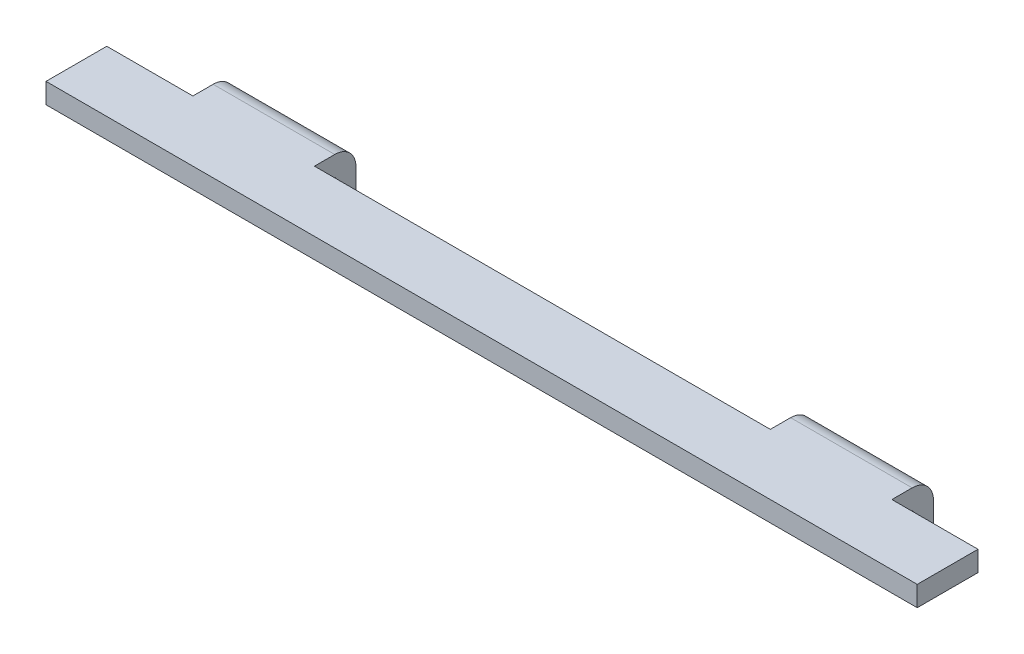
ISO-10303-21;
HEADER;
FILE_DESCRIPTION(('STEP AP214'),'2;1');
FILE_NAME('part.step','',(''),(''),'','','');
FILE_SCHEMA(('AUTOMOTIVE_DESIGN { 1 0 10303 214 1 1 1 1 }'));
ENDSEC;
DATA;
#1=APPLICATION_CONTEXT('core data for automotive mechanical design processes');
#2=APPLICATION_PROTOCOL_DEFINITION('international standard','automotive_design',2000,#1);
#3=PRODUCT_CONTEXT('',#1,'mechanical');
#4=PRODUCT('Part','Part','',(#3));
#5=PRODUCT_RELATED_PRODUCT_CATEGORY('part','',(#4));
#6=PRODUCT_DEFINITION_FORMATION('','',#4);
#7=PRODUCT_DEFINITION_CONTEXT('part definition',#1,'design');
#8=PRODUCT_DEFINITION('design','',#6,#7);
#9=PRODUCT_DEFINITION_SHAPE('','',#8);
#10=(LENGTH_UNIT() NAMED_UNIT(*) SI_UNIT(.MILLI.,.METRE.));
#11=(NAMED_UNIT(*) PLANE_ANGLE_UNIT() SI_UNIT($,.RADIAN.));
#12=(NAMED_UNIT(*) SI_UNIT($,.STERADIAN.) SOLID_ANGLE_UNIT());
#13=UNCERTAINTY_MEASURE_WITH_UNIT(LENGTH_MEASURE(1.E-05),#10,'distance_accuracy_value','');
#14=(GEOMETRIC_REPRESENTATION_CONTEXT(3) GLOBAL_UNCERTAINTY_ASSIGNED_CONTEXT((#13)) GLOBAL_UNIT_ASSIGNED_CONTEXT((#10,
#11,#12)) REPRESENTATION_CONTEXT('',''));
#15=CARTESIAN_POINT('',(0.,0.,0.));
#16=DIRECTION('',(0.,0.,1.));
#17=DIRECTION('',(1.,0.,0.));
#18=AXIS2_PLACEMENT_3D('',#15,#16,#17);
#19=CARTESIAN_POINT('',(0.,0.,-0.71));
#20=DIRECTION('',(0.,0.,-1.));
#21=DIRECTION('',(-1.,0.,0.));
#22=AXIS2_PLACEMENT_3D('',#19,#20,#21);
#23=PLANE('',#22);
#24=DIRECTION('',(0.,1.,0.));
#25=VECTOR('',#24,1.);
#26=CARTESIAN_POINT('',(3.45,0.,-0.71));
#27=LINE('',#26,#25);
#28=CARTESIAN_POINT('',(3.45,-0.53,-0.71));
#29=VERTEX_POINT('',#28);
#30=CARTESIAN_POINT('',(3.45,-0.00999999999999999,-0.71));
#31=VERTEX_POINT('',#30);
#32=EDGE_CURVE('E299',#29,#31,#27,.T.);
#33=ORIENTED_EDGE('',*,*,#32,.F.);
#34=DIRECTION('',(1.,0.,0.));
#35=VECTOR('',#34,1.);
#36=CARTESIAN_POINT('',(3.45,-0.53,-0.71));
#37=LINE('',#36,#35);
#38=CARTESIAN_POINT('',(2.25,-0.53,-0.71));
#39=VERTEX_POINT('',#38);
#40=EDGE_CURVE('E281',#29,#39,#37,.F.);
#41=ORIENTED_EDGE('',*,*,#40,.T.);
#42=DIRECTION('',(0.,1.,0.));
#43=VECTOR('',#42,1.);
#44=CARTESIAN_POINT('',(2.25,0.2,-0.71));
#45=LINE('',#44,#43);
#46=CARTESIAN_POINT('',(2.25,-0.00999999999999999,-0.71));
#47=VERTEX_POINT('',#46);
#48=EDGE_CURVE('E288',#47,#39,#45,.F.);
#49=ORIENTED_EDGE('',*,*,#48,.F.);
#50=DIRECTION('',(-1.,0.,0.));
#51=VECTOR('',#50,1.);
#52=CARTESIAN_POINT('',(2.25,-0.00999999999999998,-0.71));
#53=LINE('',#52,#51);
#54=EDGE_CURVE('E294',#31,#47,#53,.T.);
#55=ORIENTED_EDGE('',*,*,#54,.F.);
#56=EDGE_LOOP('',(#33,#41,#49,#55));
#57=FACE_BOUND('',#56,.T.);
#58=ADVANCED_FACE('F17',(#57),#23,.T.);
#59=CARTESIAN_POINT('',(3.45,-0.53,-0.71));
#60=DIRECTION('',(0.,1.,0.));
#61=DIRECTION('',(0.,0.,1.));
#62=AXIS2_PLACEMENT_3D('',#59,#60,#61);
#63=PLANE('',#62);
#64=DIRECTION('',(0.,0.,1.));
#65=VECTOR('',#64,1.);
#66=CARTESIAN_POINT('',(2.25,-0.53,-0.5));
#67=LINE('',#66,#65);
#68=CARTESIAN_POINT('',(2.25,-0.53,-0.51));
#69=VERTEX_POINT('',#68);
#70=EDGE_CURVE('E284',#39,#69,#67,.T.);
#71=ORIENTED_EDGE('',*,*,#70,.F.);
#72=ORIENTED_EDGE('',*,*,#40,.F.);
#73=DIRECTION('',(0.,0.,-1.));
#74=VECTOR('',#73,1.);
#75=CARTESIAN_POINT('',(3.45,-0.53,-0.5));
#76=LINE('',#75,#74);
#77=CARTESIAN_POINT('',(3.45,-0.53,-0.51));
#78=VERTEX_POINT('',#77);
#79=EDGE_CURVE('E174',#78,#29,#76,.T.);
#80=ORIENTED_EDGE('',*,*,#79,.F.);
#81=DIRECTION('',(-1.,0.,0.));
#82=VECTOR('',#81,1.);
#83=CARTESIAN_POINT('',(0.,-0.53,-0.51));
#84=LINE('',#83,#82);
#85=EDGE_CURVE('E166',#78,#69,#84,.T.);
#86=ORIENTED_EDGE('',*,*,#85,.T.);
#87=EDGE_LOOP('',(#71,#72,#80,#86));
#88=FACE_BOUND('',#87,.T.);
#89=ADVANCED_FACE('F450',(#88),#63,.F.);
#90=CARTESIAN_POINT('',(0.,0.,-0.51));
#91=DIRECTION('',(0.,0.,-1.));
#92=DIRECTION('',(-1.,0.,0.));
#93=AXIS2_PLACEMENT_3D('',#90,#91,#92);
#94=PLANE('',#93);
#95=DIRECTION('',(0.,1.,0.));
#96=VECTOR('',#95,1.);
#97=CARTESIAN_POINT('',(2.25,0.2,-0.51));
#98=LINE('',#97,#96);
#99=CARTESIAN_POINT('',(2.25,-0.01,-0.51));
#100=VERTEX_POINT('',#99);
#101=EDGE_CURVE('E287',#69,#100,#98,.T.);
#102=ORIENTED_EDGE('',*,*,#101,.F.);
#103=ORIENTED_EDGE('',*,*,#85,.F.);
#104=DIRECTION('',(0.,1.,0.));
#105=VECTOR('',#104,1.);
#106=CARTESIAN_POINT('',(3.45,0.,-0.51));
#107=LINE('',#106,#105);
#108=CARTESIAN_POINT('',(3.45,-0.01,-0.51));
#109=VERTEX_POINT('',#108);
#110=EDGE_CURVE('E169',#109,#78,#107,.F.);
#111=ORIENTED_EDGE('',*,*,#110,.F.);
#112=DIRECTION('',(-1.,0.,0.));
#113=VECTOR('',#112,1.);
#114=CARTESIAN_POINT('',(2.25,-0.01,-0.51));
#115=LINE('',#114,#113);
#116=EDGE_CURVE('E156',#109,#100,#115,.T.);
#117=ORIENTED_EDGE('',*,*,#116,.T.);
#118=EDGE_LOOP('',(#102,#103,#111,#117));
#119=FACE_BOUND('',#118,.T.);
#120=ADVANCED_FACE('F170',(#119),#94,.F.);
#121=CARTESIAN_POINT('',(2.25,-0.01,-0.5));
#122=DIRECTION('',(-1.,0.,0.));
#123=DIRECTION('',(0.,0.,1.));
#124=AXIS2_PLACEMENT_3D('',#121,#122,#123);
#125=CYLINDRICAL_SURFACE('',#124,0.01);
#126=DIRECTION('',(1.,0.,0.));
#127=VECTOR('',#126,1.);
#128=CARTESIAN_POINT('',(0.,0.,-0.5));
#129=LINE('',#128,#127);
#130=CARTESIAN_POINT('',(3.45,0.,-0.5));
#131=VERTEX_POINT('',#130);
#132=CARTESIAN_POINT('',(2.25,0.,-0.5));
#133=VERTEX_POINT('',#132);
#134=EDGE_CURVE('E151',#131,#133,#129,.F.);
#135=ORIENTED_EDGE('',*,*,#134,.T.);
#136=CARTESIAN_POINT('',(2.25,-0.01,-0.5));
#137=DIRECTION('',(-1.,0.,0.));
#138=DIRECTION('',(0.,0.,1.));
#139=AXIS2_PLACEMENT_3D('',#136,#137,#138);
#140=CIRCLE('',#139,0.01);
#141=EDGE_CURVE('E162',#100,#133,#140,.F.);
#142=ORIENTED_EDGE('',*,*,#141,.F.);
#143=ORIENTED_EDGE('',*,*,#116,.F.);
#144=CARTESIAN_POINT('',(3.45,-0.01,-0.5));
#145=DIRECTION('',(-1.,0.,0.));
#146=DIRECTION('',(0.,0.,1.));
#147=AXIS2_PLACEMENT_3D('',#144,#145,#146);
#148=CIRCLE('',#147,0.01);
#149=EDGE_CURVE('E20',#131,#109,#148,.T.);
#150=ORIENTED_EDGE('',*,*,#149,.F.);
#151=EDGE_LOOP('',(#135,#142,#143,#150));
#152=FACE_BOUND('',#151,.T.);
#153=ADVANCED_FACE('F158',(#152),#125,.F.);
#154=CARTESIAN_POINT('',(0.,0.,0.));
#155=DIRECTION('',(0.,1.,0.));
#156=DIRECTION('',(0.,0.,1.));
#157=AXIS2_PLACEMENT_3D('',#154,#155,#156);
#158=PLANE('',#157);
#159=DIRECTION('',(1.,0.,0.));
#160=VECTOR('',#159,1.);
#161=CARTESIAN_POINT('',(0.,0.,-0.3));
#162=LINE('',#161,#160);
#163=CARTESIAN_POINT('',(-3.45,0.,-0.3));
#164=VERTEX_POINT('',#163);
#165=CARTESIAN_POINT('',(-4.3,0.,-0.3));
#166=VERTEX_POINT('',#165);
#167=EDGE_CURVE('E254',#164,#166,#162,.F.);
#168=ORIENTED_EDGE('',*,*,#167,.F.);
#169=DIRECTION('',(0.,0.,1.));
#170=VECTOR('',#169,1.);
#171=CARTESIAN_POINT('',(-3.45,0.,0.));
#172=LINE('',#171,#170);
#173=CARTESIAN_POINT('',(-3.45,0.,-0.5));
#174=VERTEX_POINT('',#173);
#175=EDGE_CURVE('E276',#174,#164,#172,.T.);
#176=ORIENTED_EDGE('',*,*,#175,.F.);
#177=DIRECTION('',(-1.,0.,0.));
#178=VECTOR('',#177,1.);
#179=CARTESIAN_POINT('',(-3.45,0.,-0.5));
#180=LINE('',#179,#178);
#181=CARTESIAN_POINT('',(-2.25,0.,-0.5));
#182=VERTEX_POINT('',#181);
#183=EDGE_CURVE('E234',#174,#182,#180,.F.);
#184=ORIENTED_EDGE('',*,*,#183,.T.);
#185=DIRECTION('',(0.,0.,1.));
#186=VECTOR('',#185,1.);
#187=CARTESIAN_POINT('',(-2.25,0.,0.));
#188=LINE('',#187,#186);
#189=CARTESIAN_POINT('',(-2.25,0.,-0.3));
#190=VERTEX_POINT('',#189);
#191=EDGE_CURVE('E274',#190,#182,#188,.F.);
#192=ORIENTED_EDGE('',*,*,#191,.F.);
#193=DIRECTION('',(1.,0.,0.));
#194=VECTOR('',#193,1.);
#195=CARTESIAN_POINT('',(4.3,0.,-0.3));
#196=LINE('',#195,#194);
#197=CARTESIAN_POINT('',(2.25,0.,-0.3));
#198=VERTEX_POINT('',#197);
#199=EDGE_CURVE('E268',#190,#198,#196,.T.);
#200=ORIENTED_EDGE('',*,*,#199,.T.);
#201=DIRECTION('',(0.,0.,1.));
#202=VECTOR('',#201,1.);
#203=CARTESIAN_POINT('',(2.25,0.,-0.5));
#204=LINE('',#203,#202);
#205=EDGE_CURVE('E271',#133,#198,#204,.T.);
#206=ORIENTED_EDGE('',*,*,#205,.F.);
#207=ORIENTED_EDGE('',*,*,#134,.F.);
#208=DIRECTION('',(0.,0.,-1.));
#209=VECTOR('',#208,1.);
#210=CARTESIAN_POINT('',(3.45,0.,-0.5));
#211=LINE('',#210,#209);
#212=CARTESIAN_POINT('',(3.45,0.,-0.3));
#213=VERTEX_POINT('',#212);
#214=EDGE_CURVE('E178',#213,#131,#211,.T.);
#215=ORIENTED_EDGE('',*,*,#214,.F.);
#216=DIRECTION('',(1.,0.,0.));
#217=VECTOR('',#216,1.);
#218=CARTESIAN_POINT('',(4.3,0.,-0.3));
#219=LINE('',#218,#217);
#220=CARTESIAN_POINT('',(4.3,0.,-0.3));
#221=VERTEX_POINT('',#220);
#222=EDGE_CURVE('E181',#213,#221,#219,.T.);
#223=ORIENTED_EDGE('',*,*,#222,.T.);
#224=DIRECTION('',(0.,0.,1.));
#225=VECTOR('',#224,1.);
#226=CARTESIAN_POINT('',(4.3,0.,0.3));
#227=LINE('',#226,#225);
#228=CARTESIAN_POINT('',(4.3,0.,0.300000000000001));
#229=VERTEX_POINT('',#228);
#230=EDGE_CURVE('E199',#221,#229,#227,.T.);
#231=ORIENTED_EDGE('',*,*,#230,.T.);
#232=DIRECTION('',(-1.,0.,0.));
#233=VECTOR('',#232,1.);
#234=CARTESIAN_POINT('',(-4.3,0.,0.3));
#235=LINE('',#234,#233);
#236=CARTESIAN_POINT('',(-4.3,0.,0.3));
#237=VERTEX_POINT('',#236);
#238=EDGE_CURVE('E209',#229,#237,#235,.T.);
#239=ORIENTED_EDGE('',*,*,#238,.T.);
#240=DIRECTION('',(0.,0.,-1.));
#241=VECTOR('',#240,1.);
#242=CARTESIAN_POINT('',(-4.3,0.,-0.3));
#243=LINE('',#242,#241);
#244=EDGE_CURVE('E219',#237,#166,#243,.T.);
#245=ORIENTED_EDGE('',*,*,#244,.T.);
#246=EDGE_LOOP('',(#168,#176,#184,#192,#200,#206,#207,#215,#223,#231,#239,#245));
#247=FACE_BOUND('',#246,.T.);
#248=ADVANCED_FACE('F420',(#247),#158,.F.);
#249=CARTESIAN_POINT('',(0.,0.,-0.71));
#250=DIRECTION('',(0.,0.,-1.));
#251=DIRECTION('',(0.,1.,0.));
#252=AXIS2_PLACEMENT_3D('',#249,#250,#251);
#253=PLANE('',#252);
#254=DIRECTION('',(0.,1.,0.));
#255=VECTOR('',#254,1.);
#256=CARTESIAN_POINT('',(-2.25,0.,-0.71));
#257=LINE('',#256,#255);
#258=CARTESIAN_POINT('',(-2.25,-0.53,-0.71));
#259=VERTEX_POINT('',#258);
#260=CARTESIAN_POINT('',(-2.25,-0.00999999999999999,-0.71));
#261=VERTEX_POINT('',#260);
#262=EDGE_CURVE('E264',#259,#261,#257,.T.);
#263=ORIENTED_EDGE('',*,*,#262,.F.);
#264=DIRECTION('',(1.,0.,0.));
#265=VECTOR('',#264,1.);
#266=CARTESIAN_POINT('',(-2.25,-0.53,-0.71));
#267=LINE('',#266,#265);
#268=CARTESIAN_POINT('',(-3.45,-0.53,-0.71));
#269=VERTEX_POINT('',#268);
#270=EDGE_CURVE('E243',#259,#269,#267,.F.);
#271=ORIENTED_EDGE('',*,*,#270,.T.);
#272=DIRECTION('',(0.,1.,0.));
#273=VECTOR('',#272,1.);
#274=CARTESIAN_POINT('',(-3.45,0.2,-0.71));
#275=LINE('',#274,#273);
#276=CARTESIAN_POINT('',(-3.45,-0.00999999999999999,-0.71));
#277=VERTEX_POINT('',#276);
#278=EDGE_CURVE('E250',#277,#269,#275,.F.);
#279=ORIENTED_EDGE('',*,*,#278,.F.);
#280=DIRECTION('',(-1.,0.,0.));
#281=VECTOR('',#280,1.);
#282=CARTESIAN_POINT('',(-3.45,-0.00999999999999998,-0.71));
#283=LINE('',#282,#281);
#284=EDGE_CURVE('E257',#261,#277,#283,.T.);
#285=ORIENTED_EDGE('',*,*,#284,.F.);
#286=EDGE_LOOP('',(#263,#271,#279,#285));
#287=FACE_BOUND('',#286,.T.);
#288=ADVANCED_FACE('F434',(#287),#253,.T.);
#289=CARTESIAN_POINT('',(-2.25,-0.53,-0.71));
#290=DIRECTION('',(0.,1.,0.));
#291=DIRECTION('',(0.,0.,1.));
#292=AXIS2_PLACEMENT_3D('',#289,#290,#291);
#293=PLANE('',#292);
#294=DIRECTION('',(0.,0.,1.));
#295=VECTOR('',#294,1.);
#296=CARTESIAN_POINT('',(-3.45,-0.53,-0.5));
#297=LINE('',#296,#295);
#298=CARTESIAN_POINT('',(-3.45,-0.53,-0.51));
#299=VERTEX_POINT('',#298);
#300=EDGE_CURVE('E246',#269,#299,#297,.T.);
#301=ORIENTED_EDGE('',*,*,#300,.F.);
#302=ORIENTED_EDGE('',*,*,#270,.F.);
#303=DIRECTION('',(0.,0.,-1.));
#304=VECTOR('',#303,1.);
#305=CARTESIAN_POINT('',(-2.25,-0.53,-0.5));
#306=LINE('',#305,#304);
#307=CARTESIAN_POINT('',(-2.25,-0.53,-0.51));
#308=VERTEX_POINT('',#307);
#309=EDGE_CURVE('E261',#308,#259,#306,.T.);
#310=ORIENTED_EDGE('',*,*,#309,.F.);
#311=DIRECTION('',(1.,0.,0.));
#312=VECTOR('',#311,1.);
#313=CARTESIAN_POINT('',(0.,-0.53,-0.51));
#314=LINE('',#313,#312);
#315=EDGE_CURVE('E239',#308,#299,#314,.F.);
#316=ORIENTED_EDGE('',*,*,#315,.T.);
#317=EDGE_LOOP('',(#301,#302,#310,#316));
#318=FACE_BOUND('',#317,.T.);
#319=ADVANCED_FACE('F436',(#318),#293,.F.);
#320=CARTESIAN_POINT('',(0.,0.,-0.51));
#321=DIRECTION('',(0.,0.,-1.));
#322=DIRECTION('',(0.,1.,0.));
#323=AXIS2_PLACEMENT_3D('',#320,#321,#322);
#324=PLANE('',#323);
#325=DIRECTION('',(0.,1.,0.));
#326=VECTOR('',#325,1.);
#327=CARTESIAN_POINT('',(-3.45,0.2,-0.51));
#328=LINE('',#327,#326);
#329=CARTESIAN_POINT('',(-3.45,-0.01,-0.51));
#330=VERTEX_POINT('',#329);
#331=EDGE_CURVE('E249',#299,#330,#328,.T.);
#332=ORIENTED_EDGE('',*,*,#331,.F.);
#333=ORIENTED_EDGE('',*,*,#315,.F.);
#334=DIRECTION('',(0.,1.,0.));
#335=VECTOR('',#334,1.);
#336=CARTESIAN_POINT('',(-2.25,0.,-0.51));
#337=LINE('',#336,#335);
#338=CARTESIAN_POINT('',(-2.25,-0.01,-0.51));
#339=VERTEX_POINT('',#338);
#340=EDGE_CURVE('E265',#339,#308,#337,.F.);
#341=ORIENTED_EDGE('',*,*,#340,.F.);
#342=DIRECTION('',(-1.,0.,0.));
#343=VECTOR('',#342,1.);
#344=CARTESIAN_POINT('',(-3.45,-0.01,-0.51));
#345=LINE('',#344,#343);
#346=EDGE_CURVE('E237',#339,#330,#345,.T.);
#347=ORIENTED_EDGE('',*,*,#346,.T.);
#348=EDGE_LOOP('',(#332,#333,#341,#347));
#349=FACE_BOUND('',#348,.T.);
#350=ADVANCED_FACE('F412',(#349),#324,.F.);
#351=CARTESIAN_POINT('',(-3.45,-0.01,-0.5));
#352=DIRECTION('',(-1.,0.,0.));
#353=DIRECTION('',(0.,0.,1.));
#354=AXIS2_PLACEMENT_3D('',#351,#352,#353);
#355=CYLINDRICAL_SURFACE('',#354,0.01);
#356=ORIENTED_EDGE('',*,*,#183,.F.);
#357=CARTESIAN_POINT('',(-3.45,-0.01,-0.5));
#358=DIRECTION('',(-1.,0.,0.));
#359=DIRECTION('',(0.,0.,1.));
#360=AXIS2_PLACEMENT_3D('',#357,#358,#359);
#361=CIRCLE('',#360,0.01);
#362=EDGE_CURVE('E229',#330,#174,#361,.F.);
#363=ORIENTED_EDGE('',*,*,#362,.F.);
#364=ORIENTED_EDGE('',*,*,#346,.F.);
#365=CARTESIAN_POINT('',(-2.25,-0.01,-0.5));
#366=DIRECTION('',(-1.,0.,0.));
#367=DIRECTION('',(0.,0.,1.));
#368=AXIS2_PLACEMENT_3D('',#365,#366,#367);
#369=CIRCLE('',#368,0.01);
#370=EDGE_CURVE('E326',#182,#339,#369,.T.);
#371=ORIENTED_EDGE('',*,*,#370,.F.);
#372=EDGE_LOOP('',(#356,#363,#364,#371));
#373=FACE_BOUND('',#372,.T.);
#374=ADVANCED_FACE('F418',(#373),#355,.F.);
#375=CARTESIAN_POINT('',(-4.3,0.2,-0.3));
#376=DIRECTION('',(1.,0.,0.));
#377=DIRECTION('',(0.,0.,-1.));
#378=AXIS2_PLACEMENT_3D('',#375,#376,#377);
#379=PLANE('',#378);
#380=DIRECTION('',(0.,1.,0.));
#381=VECTOR('',#380,1.);
#382=CARTESIAN_POINT('',(-4.3,0.2,0.3));
#383=LINE('',#382,#381);
#384=CARTESIAN_POINT('',(-4.3,0.2,0.3));
#385=VERTEX_POINT('',#384);
#386=EDGE_CURVE('E217',#237,#385,#383,.T.);
#387=ORIENTED_EDGE('',*,*,#386,.T.);
#388=DIRECTION('',(0.,0.,1.));
#389=VECTOR('',#388,1.);
#390=CARTESIAN_POINT('',(-4.3,0.2,0.));
#391=LINE('',#390,#389);
#392=CARTESIAN_POINT('',(-4.3,0.2,-0.3));
#393=VERTEX_POINT('',#392);
#394=EDGE_CURVE('E214',#393,#385,#391,.T.);
#395=ORIENTED_EDGE('',*,*,#394,.F.);
#396=DIRECTION('',(0.,1.,0.));
#397=VECTOR('',#396,1.);
#398=CARTESIAN_POINT('',(-4.3,0.2,-0.3));
#399=LINE('',#398,#397);
#400=EDGE_CURVE('E226',#393,#166,#399,.F.);
#401=ORIENTED_EDGE('',*,*,#400,.T.);
#402=ORIENTED_EDGE('',*,*,#244,.F.);
#403=EDGE_LOOP('',(#387,#395,#401,#402));
#404=FACE_BOUND('',#403,.T.);
#405=ADVANCED_FACE('F467',(#404),#379,.F.);
#406=CARTESIAN_POINT('',(-4.3,0.2,0.3));
#407=DIRECTION('',(0.,0.,-1.));
#408=DIRECTION('',(-1.,0.,0.));
#409=AXIS2_PLACEMENT_3D('',#406,#407,#408);
#410=PLANE('',#409);
#411=DIRECTION('',(0.,1.,0.));
#412=VECTOR('',#411,1.);
#413=CARTESIAN_POINT('',(4.3,0.2,0.3));
#414=LINE('',#413,#412);
#415=CARTESIAN_POINT('',(4.3,0.2,0.3));
#416=VERTEX_POINT('',#415);
#417=EDGE_CURVE('E207',#229,#416,#414,.T.);
#418=ORIENTED_EDGE('',*,*,#417,.T.);
#419=DIRECTION('',(1.,0.,0.));
#420=VECTOR('',#419,1.);
#421=CARTESIAN_POINT('',(0.,0.2,0.3));
#422=LINE('',#421,#420);
#423=EDGE_CURVE('E204',#385,#416,#422,.T.);
#424=ORIENTED_EDGE('',*,*,#423,.F.);
#425=ORIENTED_EDGE('',*,*,#386,.F.);
#426=ORIENTED_EDGE('',*,*,#238,.F.);
#427=EDGE_LOOP('',(#418,#424,#425,#426));
#428=FACE_BOUND('',#427,.T.);
#429=ADVANCED_FACE('F465',(#428),#410,.F.);
#430=CARTESIAN_POINT('',(4.3,0.2,0.3));
#431=DIRECTION('',(-1.,0.,0.));
#432=DIRECTION('',(0.,0.,1.));
#433=AXIS2_PLACEMENT_3D('',#430,#431,#432);
#434=PLANE('',#433);
#435=DIRECTION('',(0.,1.,0.));
#436=VECTOR('',#435,1.);
#437=CARTESIAN_POINT('',(4.3,0.2,-0.3));
#438=LINE('',#437,#436);
#439=CARTESIAN_POINT('',(4.3,0.2,-0.3));
#440=VERTEX_POINT('',#439);
#441=EDGE_CURVE('E197',#221,#440,#438,.T.);
#442=ORIENTED_EDGE('',*,*,#441,.T.);
#443=DIRECTION('',(0.,0.,1.));
#444=VECTOR('',#443,1.);
#445=CARTESIAN_POINT('',(4.3,0.2,0.));
#446=LINE('',#445,#444);
#447=EDGE_CURVE('E194',#416,#440,#446,.F.);
#448=ORIENTED_EDGE('',*,*,#447,.F.);
#449=ORIENTED_EDGE('',*,*,#417,.F.);
#450=ORIENTED_EDGE('',*,*,#230,.F.);
#451=EDGE_LOOP('',(#442,#448,#449,#450));
#452=FACE_BOUND('',#451,.T.);
#453=ADVANCED_FACE('F462',(#452),#434,.F.);
#454=CARTESIAN_POINT('',(4.3,0.2,-0.3));
#455=DIRECTION('',(0.,0.,1.));
#456=DIRECTION('',(1.,0.,0.));
#457=AXIS2_PLACEMENT_3D('',#454,#455,#456);
#458=PLANE('',#457);
#459=DIRECTION('',(0.,1.,0.));
#460=VECTOR('',#459,1.);
#461=CARTESIAN_POINT('',(3.45,0.,-0.3));
#462=LINE('',#461,#460);
#463=CARTESIAN_POINT('',(3.45,0.2,-0.3));
#464=VERTEX_POINT('',#463);
#465=EDGE_CURVE('E179',#464,#213,#462,.F.);
#466=ORIENTED_EDGE('',*,*,#465,.F.);
#467=DIRECTION('',(1.,0.,0.));
#468=VECTOR('',#467,1.);
#469=CARTESIAN_POINT('',(0.,0.2,-0.3));
#470=LINE('',#469,#468);
#471=EDGE_CURVE('E190',#440,#464,#470,.F.);
#472=ORIENTED_EDGE('',*,*,#471,.F.);
#473=ORIENTED_EDGE('',*,*,#441,.F.);
#474=ORIENTED_EDGE('',*,*,#222,.F.);
#475=EDGE_LOOP('',(#466,#472,#473,#474));
#476=FACE_BOUND('',#475,.T.);
#477=ADVANCED_FACE('F456',(#476),#458,.F.);
#478=CARTESIAN_POINT('',(3.45,0.,-0.5));
#479=DIRECTION('',(1.,0.,0.));
#480=DIRECTION('',(0.,0.,-1.));
#481=AXIS2_PLACEMENT_3D('',#478,#479,#480);
#482=PLANE('',#481);
#483=CARTESIAN_POINT('',(3.45,-0.01,-0.5));
#484=DIRECTION('',(-1.,0.,0.));
#485=DIRECTION('',(0.,0.,1.));
#486=AXIS2_PLACEMENT_3D('',#483,#484,#485);
#487=CIRCLE('',#486,0.21);
#488=CARTESIAN_POINT('',(3.45,0.2,-0.5));
#489=VERTEX_POINT('',#488);
#490=EDGE_CURVE('E297',#489,#31,#487,.T.);
#491=ORIENTED_EDGE('',*,*,#490,.F.);
#492=DIRECTION('',(0.,0.,1.));
#493=VECTOR('',#492,1.);
#494=CARTESIAN_POINT('',(3.45,0.2,0.));
#495=LINE('',#494,#493);
#496=EDGE_CURVE('E193',#464,#489,#495,.F.);
#497=ORIENTED_EDGE('',*,*,#496,.F.);
#498=ORIENTED_EDGE('',*,*,#465,.T.);
#499=ORIENTED_EDGE('',*,*,#214,.T.);
#500=ORIENTED_EDGE('',*,*,#149,.T.);
#501=ORIENTED_EDGE('',*,*,#110,.T.);
#502=ORIENTED_EDGE('',*,*,#79,.T.);
#503=ORIENTED_EDGE('',*,*,#32,.T.);
#504=EDGE_LOOP('',(#491,#497,#498,#499,#500,#501,#502,#503));
#505=FACE_BOUND('',#504,.T.);
#506=ADVANCED_FACE('F176',(#505),#482,.T.);
#507=CARTESIAN_POINT('',(2.25,-0.01,-0.5));
#508=DIRECTION('',(-1.,0.,0.));
#509=DIRECTION('',(0.,0.,1.));
#510=AXIS2_PLACEMENT_3D('',#507,#508,#509);
#511=CYLINDRICAL_SURFACE('',#510,0.21);
#512=CARTESIAN_POINT('',(2.25,-0.01,-0.5));
#513=DIRECTION('',(-1.,0.,0.));
#514=DIRECTION('',(0.,0.,1.));
#515=AXIS2_PLACEMENT_3D('',#512,#513,#514);
#516=CIRCLE('',#515,0.21);
#517=CARTESIAN_POINT('',(2.25,0.2,-0.5));
#518=VERTEX_POINT('',#517);
#519=EDGE_CURVE('E296',#518,#47,#516,.T.);
#520=ORIENTED_EDGE('',*,*,#519,.F.);
#521=DIRECTION('',(1.,0.,0.));
#522=VECTOR('',#521,1.);
#523=CARTESIAN_POINT('',(0.,0.2,-0.5));
#524=LINE('',#523,#522);
#525=EDGE_CURVE('E345',#489,#518,#524,.F.);
#526=ORIENTED_EDGE('',*,*,#525,.F.);
#527=ORIENTED_EDGE('',*,*,#490,.T.);
#528=ORIENTED_EDGE('',*,*,#54,.T.);
#529=EDGE_LOOP('',(#520,#526,#527,#528));
#530=FACE_BOUND('',#529,.T.);
#531=ADVANCED_FACE('F452',(#530),#511,.T.);
#532=CARTESIAN_POINT('',(2.25,0.2,-0.5));
#533=DIRECTION('',(-1.,0.,0.));
#534=DIRECTION('',(0.,0.,1.));
#535=AXIS2_PLACEMENT_3D('',#532,#533,#534);
#536=PLANE('',#535);
#537=ORIENTED_EDGE('',*,*,#141,.T.);
#538=ORIENTED_EDGE('',*,*,#205,.T.);
#539=DIRECTION('',(0.,1.,0.));
#540=VECTOR('',#539,1.);
#541=CARTESIAN_POINT('',(2.25,0.2,-0.3));
#542=LINE('',#541,#540);
#543=CARTESIAN_POINT('',(2.25,0.2,-0.3));
#544=VERTEX_POINT('',#543);
#545=EDGE_CURVE('E270',#198,#544,#542,.T.);
#546=ORIENTED_EDGE('',*,*,#545,.T.);
#547=DIRECTION('',(0.,0.,1.));
#548=VECTOR('',#547,1.);
#549=CARTESIAN_POINT('',(2.25,0.2,0.));
#550=LINE('',#549,#548);
#551=EDGE_CURVE('E348',#518,#544,#550,.T.);
#552=ORIENTED_EDGE('',*,*,#551,.F.);
#553=ORIENTED_EDGE('',*,*,#519,.T.);
#554=ORIENTED_EDGE('',*,*,#48,.T.);
#555=ORIENTED_EDGE('',*,*,#70,.T.);
#556=ORIENTED_EDGE('',*,*,#101,.T.);
#557=EDGE_LOOP('',(#537,#538,#546,#552,#553,#554,#555,#556));
#558=FACE_BOUND('',#557,.T.);
#559=ADVANCED_FACE('F445',(#558),#536,.T.);
#560=CARTESIAN_POINT('',(4.3,0.2,-0.3));
#561=DIRECTION('',(0.,0.,1.));
#562=DIRECTION('',(1.,0.,0.));
#563=AXIS2_PLACEMENT_3D('',#560,#561,#562);
#564=PLANE('',#563);
#565=ORIENTED_EDGE('',*,*,#545,.F.);
#566=ORIENTED_EDGE('',*,*,#199,.F.);
#567=DIRECTION('',(0.,1.,0.));
#568=VECTOR('',#567,1.);
#569=CARTESIAN_POINT('',(-2.25,0.,-0.3));
#570=LINE('',#569,#568);
#571=CARTESIAN_POINT('',(-2.25,0.2,-0.3));
#572=VERTEX_POINT('',#571);
#573=EDGE_CURVE('E329',#572,#190,#570,.F.);
#574=ORIENTED_EDGE('',*,*,#573,.F.);
#575=DIRECTION('',(1.,0.,0.));
#576=VECTOR('',#575,1.);
#577=CARTESIAN_POINT('',(0.,0.2,-0.3));
#578=LINE('',#577,#576);
#579=EDGE_CURVE('E364',#544,#572,#578,.F.);
#580=ORIENTED_EDGE('',*,*,#579,.F.);
#581=EDGE_LOOP('',(#565,#566,#574,#580));
#582=FACE_BOUND('',#581,.T.);
#583=ADVANCED_FACE('F443',(#582),#564,.F.);
#584=CARTESIAN_POINT('',(-2.25,0.,-0.5));
#585=DIRECTION('',(1.,0.,0.));
#586=DIRECTION('',(0.,0.,-1.));
#587=AXIS2_PLACEMENT_3D('',#584,#585,#586);
#588=PLANE('',#587);
#589=CARTESIAN_POINT('',(-2.25,-0.01,-0.5));
#590=DIRECTION('',(-1.,0.,0.));
#591=DIRECTION('',(0.,0.,1.));
#592=AXIS2_PLACEMENT_3D('',#589,#590,#591);
#593=CIRCLE('',#592,0.21);
#594=CARTESIAN_POINT('',(-2.25,0.2,-0.5));
#595=VERTEX_POINT('',#594);
#596=EDGE_CURVE('E260',#595,#261,#593,.T.);
#597=ORIENTED_EDGE('',*,*,#596,.F.);
#598=DIRECTION('',(0.,0.,1.));
#599=VECTOR('',#598,1.);
#600=CARTESIAN_POINT('',(-2.25,0.2,0.));
#601=LINE('',#600,#599);
#602=EDGE_CURVE('E372',#572,#595,#601,.F.);
#603=ORIENTED_EDGE('',*,*,#602,.F.);
#604=ORIENTED_EDGE('',*,*,#573,.T.);
#605=ORIENTED_EDGE('',*,*,#191,.T.);
#606=ORIENTED_EDGE('',*,*,#370,.T.);
#607=ORIENTED_EDGE('',*,*,#340,.T.);
#608=ORIENTED_EDGE('',*,*,#309,.T.);
#609=ORIENTED_EDGE('',*,*,#262,.T.);
#610=EDGE_LOOP('',(#597,#603,#604,#605,#606,#607,#608,#609));
#611=FACE_BOUND('',#610,.T.);
#612=ADVANCED_FACE('F438',(#611),#588,.T.);
#613=CARTESIAN_POINT('',(-3.45,-0.01,-0.5));
#614=DIRECTION('',(-1.,0.,0.));
#615=DIRECTION('',(0.,0.,1.));
#616=AXIS2_PLACEMENT_3D('',#613,#614,#615);
#617=CYLINDRICAL_SURFACE('',#616,0.21);
#618=CARTESIAN_POINT('',(-3.45,-0.01,-0.5));
#619=DIRECTION('',(-1.,0.,0.));
#620=DIRECTION('',(0.,0.,1.));
#621=AXIS2_PLACEMENT_3D('',#618,#619,#620);
#622=CIRCLE('',#621,0.21);
#623=CARTESIAN_POINT('',(-3.45,0.2,-0.5));
#624=VERTEX_POINT('',#623);
#625=EDGE_CURVE('E259',#624,#277,#622,.T.);
#626=ORIENTED_EDGE('',*,*,#625,.F.);
#627=DIRECTION('',(1.,0.,0.));
#628=VECTOR('',#627,1.);
#629=CARTESIAN_POINT('',(0.,0.2,-0.5));
#630=LINE('',#629,#628);
#631=EDGE_CURVE('E388',#595,#624,#630,.F.);
#632=ORIENTED_EDGE('',*,*,#631,.F.);
#633=ORIENTED_EDGE('',*,*,#596,.T.);
#634=ORIENTED_EDGE('',*,*,#284,.T.);
#635=EDGE_LOOP('',(#626,#632,#633,#634));
#636=FACE_BOUND('',#635,.T.);
#637=ADVANCED_FACE('F430',(#636),#617,.T.);
#638=CARTESIAN_POINT('',(-3.45,0.2,-0.5));
#639=DIRECTION('',(-1.,0.,0.));
#640=DIRECTION('',(0.,0.,1.));
#641=AXIS2_PLACEMENT_3D('',#638,#639,#640);
#642=PLANE('',#641);
#643=ORIENTED_EDGE('',*,*,#362,.T.);
#644=ORIENTED_EDGE('',*,*,#175,.T.);
#645=DIRECTION('',(0.,1.,0.));
#646=VECTOR('',#645,1.);
#647=CARTESIAN_POINT('',(-3.45,0.2,-0.3));
#648=LINE('',#647,#646);
#649=CARTESIAN_POINT('',(-3.45,0.2,-0.3));
#650=VERTEX_POINT('',#649);
#651=EDGE_CURVE('E35',#164,#650,#648,.T.);
#652=ORIENTED_EDGE('',*,*,#651,.T.);
#653=DIRECTION('',(0.,0.,1.));
#654=VECTOR('',#653,1.);
#655=CARTESIAN_POINT('',(-3.45,0.2,0.));
#656=LINE('',#655,#654);
#657=EDGE_CURVE('E26',#624,#650,#656,.T.);
#658=ORIENTED_EDGE('',*,*,#657,.F.);
#659=ORIENTED_EDGE('',*,*,#625,.T.);
#660=ORIENTED_EDGE('',*,*,#278,.T.);
#661=ORIENTED_EDGE('',*,*,#300,.T.);
#662=ORIENTED_EDGE('',*,*,#331,.T.);
#663=EDGE_LOOP('',(#643,#644,#652,#658,#659,#660,#661,#662));
#664=FACE_BOUND('',#663,.T.);
#665=ADVANCED_FACE('F408',(#664),#642,.T.);
#666=CARTESIAN_POINT('',(4.3,0.2,-0.3));
#667=DIRECTION('',(0.,0.,1.));
#668=DIRECTION('',(1.,0.,0.));
#669=AXIS2_PLACEMENT_3D('',#666,#667,#668);
#670=PLANE('',#669);
#671=ORIENTED_EDGE('',*,*,#651,.F.);
#672=ORIENTED_EDGE('',*,*,#167,.T.);
#673=ORIENTED_EDGE('',*,*,#400,.F.);
#674=DIRECTION('',(1.,0.,0.));
#675=VECTOR('',#674,1.);
#676=CARTESIAN_POINT('',(0.,0.2,-0.3));
#677=LINE('',#676,#675);
#678=EDGE_CURVE('E11',#650,#393,#677,.F.);
#679=ORIENTED_EDGE('',*,*,#678,.F.);
#680=EDGE_LOOP('',(#671,#672,#673,#679));
#681=FACE_BOUND('',#680,.T.);
#682=ADVANCED_FACE('F423',(#681),#670,.F.);
#683=CARTESIAN_POINT('',(0.,0.2,0.));
#684=DIRECTION('',(0.,1.,0.));
#685=DIRECTION('',(0.,0.,1.));
#686=AXIS2_PLACEMENT_3D('',#683,#684,#685);
#687=PLANE('',#686);
#688=ORIENTED_EDGE('',*,*,#657,.T.);
#689=ORIENTED_EDGE('',*,*,#678,.T.);
#690=ORIENTED_EDGE('',*,*,#394,.T.);
#691=ORIENTED_EDGE('',*,*,#423,.T.);
#692=ORIENTED_EDGE('',*,*,#447,.T.);
#693=ORIENTED_EDGE('',*,*,#471,.T.);
#694=ORIENTED_EDGE('',*,*,#496,.T.);
#695=ORIENTED_EDGE('',*,*,#525,.T.);
#696=ORIENTED_EDGE('',*,*,#551,.T.);
#697=ORIENTED_EDGE('',*,*,#579,.T.);
#698=ORIENTED_EDGE('',*,*,#602,.T.);
#699=ORIENTED_EDGE('',*,*,#631,.T.);
#700=EDGE_LOOP('',(#688,#689,#690,#691,#692,#693,#694,#695,#696,#697,#698,#699));
#701=FACE_BOUND('',#700,.T.);
#702=ADVANCED_FACE('F426',(#701),#687,.T.);
#703=CLOSED_SHELL('',(#58,#89,#120,#153,#248,#288,#319,#350,#374,#405,#429,#453,#477,#506,#531,
#559,#583,#612,#637,#665,#682,#702));
#704=MANIFOLD_SOLID_BREP('B1',#703);
#705=ADVANCED_BREP_SHAPE_REPRESENTATION('',(#18,#704),#14);
#706=SHAPE_DEFINITION_REPRESENTATION(#9,#705);
ENDSEC;
END-ISO-10303-21;
